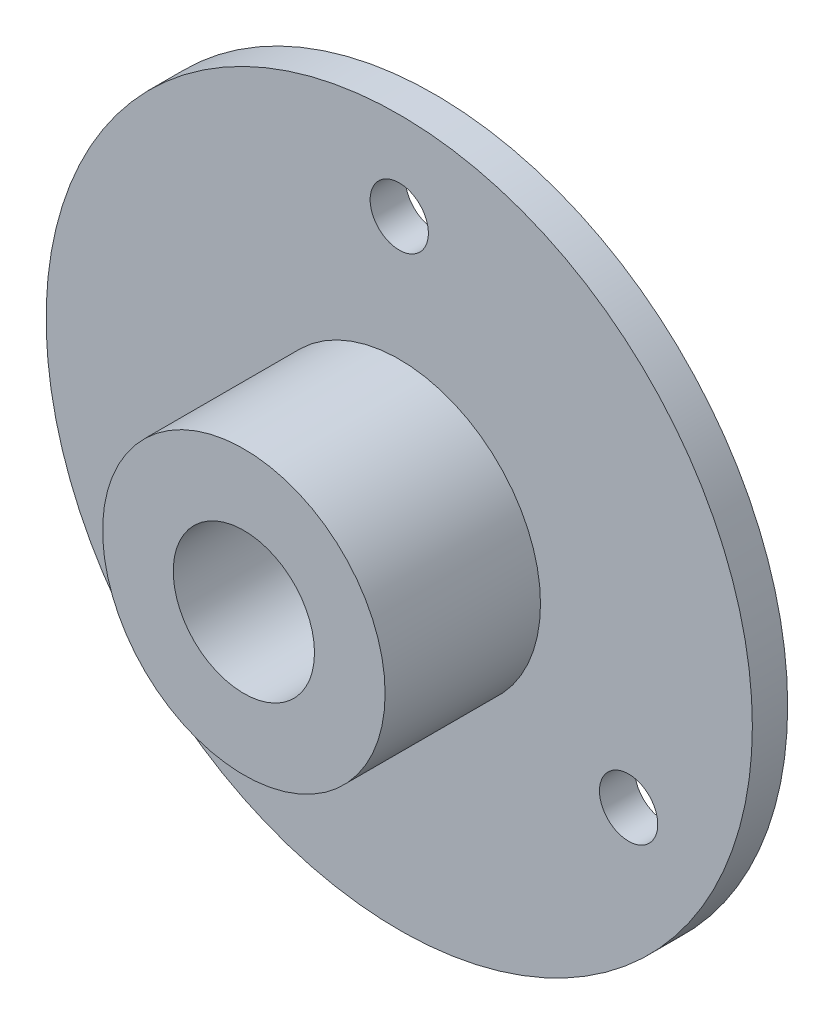
ISO-10303-21;
HEADER;
FILE_DESCRIPTION(('STEP AP214'),'2;1');
FILE_NAME('part.step','',(''),(''),'','','');
FILE_SCHEMA(('AUTOMOTIVE_DESIGN { 1 0 10303 214 1 1 1 1 }'));
ENDSEC;
DATA;
#1=APPLICATION_CONTEXT('core data for automotive mechanical design processes');
#2=APPLICATION_PROTOCOL_DEFINITION('international standard','automotive_design',2000,#1);
#3=PRODUCT_CONTEXT('',#1,'mechanical');
#4=PRODUCT('Part','Part','',(#3));
#5=PRODUCT_RELATED_PRODUCT_CATEGORY('part','',(#4));
#6=PRODUCT_DEFINITION_FORMATION('','',#4);
#7=PRODUCT_DEFINITION_CONTEXT('part definition',#1,'design');
#8=PRODUCT_DEFINITION('design','',#6,#7);
#9=PRODUCT_DEFINITION_SHAPE('','',#8);
#10=(LENGTH_UNIT() NAMED_UNIT(*) SI_UNIT(.MILLI.,.METRE.));
#11=(NAMED_UNIT(*) PLANE_ANGLE_UNIT() SI_UNIT($,.RADIAN.));
#12=(NAMED_UNIT(*) SI_UNIT($,.STERADIAN.) SOLID_ANGLE_UNIT());
#13=UNCERTAINTY_MEASURE_WITH_UNIT(LENGTH_MEASURE(1.E-05),#10,'distance_accuracy_value','');
#14=(GEOMETRIC_REPRESENTATION_CONTEXT(3) GLOBAL_UNCERTAINTY_ASSIGNED_CONTEXT((#13)) GLOBAL_UNIT_ASSIGNED_CONTEXT((#10,
#11,#12)) REPRESENTATION_CONTEXT('',''));
#15=CARTESIAN_POINT('',(0.,0.,0.));
#16=DIRECTION('',(0.,0.,1.));
#17=DIRECTION('',(1.,0.,0.));
#18=AXIS2_PLACEMENT_3D('',#15,#16,#17);
#19=CARTESIAN_POINT('',(0.,0.,2.));
#20=DIRECTION('',(0.,0.,-1.));
#21=DIRECTION('',(-1.,0.,0.));
#22=AXIS2_PLACEMENT_3D('',#19,#20,#21);
#23=CYLINDRICAL_SURFACE('',#22,20.);
#24=CARTESIAN_POINT('',(0.,0.,2.));
#25=DIRECTION('',(0.,0.,1.));
#26=DIRECTION('',(1.,0.,0.));
#27=AXIS2_PLACEMENT_3D('',#24,#25,#26);
#28=CIRCLE('',#27,20.);
#29=CARTESIAN_POINT('',(20.,0.,2.));
#30=VERTEX_POINT('',#29);
#31=EDGE_CURVE('E10',#30,#30,#28,.T.);
#32=ORIENTED_EDGE('',*,*,#31,.F.);
#33=EDGE_LOOP('',(#32));
#34=FACE_BOUND('',#33,.T.);
#35=CARTESIAN_POINT('',(0.,0.,0.));
#36=DIRECTION('',(0.,0.,1.));
#37=DIRECTION('',(1.,0.,0.));
#38=AXIS2_PLACEMENT_3D('',#35,#36,#37);
#39=CIRCLE('',#38,20.);
#40=CARTESIAN_POINT('',(20.,0.,0.));
#41=VERTEX_POINT('',#40);
#42=EDGE_CURVE('E34',#41,#41,#39,.T.);
#43=ORIENTED_EDGE('',*,*,#42,.T.);
#44=EDGE_LOOP('',(#43));
#45=FACE_BOUND('',#44,.T.);
#46=ADVANCED_FACE('F31',(#34,#45),#23,.T.);
#47=CARTESIAN_POINT('',(0.,0.,2.));
#48=DIRECTION('',(0.,0.,1.));
#49=DIRECTION('',(1.,0.,0.));
#50=AXIS2_PLACEMENT_3D('',#47,#48,#49);
#51=PLANE('',#50);
#52=CARTESIAN_POINT('',(12.9903810567666,-7.49999999999988,2.));
#53=DIRECTION('',(0.,0.,1.));
#54=DIRECTION('',(-0.499999999999992,-0.866025403784443,0.));
#55=AXIS2_PLACEMENT_3D('',#52,#53,#54);
#56=CIRCLE('',#55,1.65);
#57=CARTESIAN_POINT('',(13.8153810567666,-6.07105808375555,2.));
#58=VERTEX_POINT('',#57);
#59=EDGE_CURVE('E69',#58,#58,#56,.T.);
#60=ORIENTED_EDGE('',*,*,#59,.F.);
#61=EDGE_LOOP('',(#60));
#62=FACE_BOUND('',#61,.T.);
#63=CARTESIAN_POINT('',(-12.9903810567665,-7.50000000000006,2.));
#64=DIRECTION('',(0.,0.,1.));
#65=DIRECTION('',(-0.500000000000004,0.866025403784436,0.));
#66=AXIS2_PLACEMENT_3D('',#63,#64,#65);
#67=CIRCLE('',#66,1.65);
#68=CARTESIAN_POINT('',(-12.1653810567665,-8.92894191624438,2.));
#69=VERTEX_POINT('',#68);
#70=EDGE_CURVE('E63',#69,#69,#67,.T.);
#71=ORIENTED_EDGE('',*,*,#70,.F.);
#72=EDGE_LOOP('',(#71));
#73=FACE_BOUND('',#72,.T.);
#74=CARTESIAN_POINT('',(0.,15.,2.));
#75=DIRECTION('',(0.,0.,1.));
#76=DIRECTION('',(1.,0.,0.));
#77=AXIS2_PLACEMENT_3D('',#74,#75,#76);
#78=CIRCLE('',#77,1.65);
#79=CARTESIAN_POINT('',(-1.65,15.,2.));
#80=VERTEX_POINT('',#79);
#81=EDGE_CURVE('E52',#80,#80,#78,.T.);
#82=ORIENTED_EDGE('',*,*,#81,.F.);
#83=EDGE_LOOP('',(#82));
#84=FACE_BOUND('',#83,.T.);
#85=CARTESIAN_POINT('',(0.,0.,2.));
#86=DIRECTION('',(0.,0.,1.));
#87=DIRECTION('',(1.,0.,0.));
#88=AXIS2_PLACEMENT_3D('',#85,#86,#87);
#89=CIRCLE('',#88,8.);
#90=CARTESIAN_POINT('',(8.,0.,2.));
#91=VERTEX_POINT('',#90);
#92=EDGE_CURVE('E43',#91,#91,#89,.T.);
#93=ORIENTED_EDGE('',*,*,#92,.F.);
#94=EDGE_LOOP('',(#93));
#95=FACE_BOUND('',#94,.T.);
#96=ORIENTED_EDGE('',*,*,#31,.T.);
#97=EDGE_LOOP('',(#96));
#98=FACE_BOUND('',#97,.T.);
#99=ADVANCED_FACE('F76',(#62,#73,#84,#95,#98),#51,.T.);
#100=CARTESIAN_POINT('',(0.,0.,0.));
#101=DIRECTION('',(0.,0.,1.));
#102=DIRECTION('',(1.,0.,0.));
#103=AXIS2_PLACEMENT_3D('',#100,#101,#102);
#104=PLANE('',#103);
#105=CARTESIAN_POINT('',(12.9903810567666,-7.49999999999988,0.));
#106=DIRECTION('',(0.,0.,-1.));
#107=DIRECTION('',(0.499999999999992,0.866025403784443,0.));
#108=AXIS2_PLACEMENT_3D('',#105,#106,#107);
#109=CIRCLE('',#108,1.65);
#110=CARTESIAN_POINT('',(13.8153810567666,-6.07105808375555,0.));
#111=VERTEX_POINT('',#110);
#112=EDGE_CURVE('E66',#111,#111,#109,.T.);
#113=ORIENTED_EDGE('',*,*,#112,.F.);
#114=EDGE_LOOP('',(#113));
#115=FACE_BOUND('',#114,.T.);
#116=CARTESIAN_POINT('',(-12.9903810567665,-7.50000000000006,0.));
#117=DIRECTION('',(0.,0.,-1.));
#118=DIRECTION('',(0.500000000000004,-0.866025403784436,0.));
#119=AXIS2_PLACEMENT_3D('',#116,#117,#118);
#120=CIRCLE('',#119,1.65);
#121=CARTESIAN_POINT('',(-12.1653810567665,-8.92894191624438,0.));
#122=VERTEX_POINT('',#121);
#123=EDGE_CURVE('E60',#122,#122,#120,.T.);
#124=ORIENTED_EDGE('',*,*,#123,.F.);
#125=EDGE_LOOP('',(#124));
#126=FACE_BOUND('',#125,.T.);
#127=CARTESIAN_POINT('',(0.,15.,0.));
#128=DIRECTION('',(0.,0.,-1.));
#129=DIRECTION('',(-1.,0.,0.));
#130=AXIS2_PLACEMENT_3D('',#127,#128,#129);
#131=CIRCLE('',#130,1.65);
#132=CARTESIAN_POINT('',(-1.65,15.,0.));
#133=VERTEX_POINT('',#132);
#134=EDGE_CURVE('E57',#133,#133,#131,.T.);
#135=ORIENTED_EDGE('',*,*,#134,.F.);
#136=EDGE_LOOP('',(#135));
#137=FACE_BOUND('',#136,.T.);
#138=CARTESIAN_POINT('',(0.,0.,0.));
#139=DIRECTION('',(0.,0.,1.));
#140=DIRECTION('',(1.,0.,0.));
#141=AXIS2_PLACEMENT_3D('',#138,#139,#140);
#142=CIRCLE('',#141,4.);
#143=CARTESIAN_POINT('',(4.,0.,0.));
#144=VERTEX_POINT('',#143);
#145=EDGE_CURVE('E46',#144,#144,#142,.T.);
#146=ORIENTED_EDGE('',*,*,#145,.T.);
#147=EDGE_LOOP('',(#146));
#148=FACE_BOUND('',#147,.T.);
#149=ORIENTED_EDGE('',*,*,#42,.F.);
#150=EDGE_LOOP('',(#149));
#151=FACE_BOUND('',#150,.T.);
#152=ADVANCED_FACE('F79',(#115,#126,#137,#148,#151),#104,.F.);
#153=CARTESIAN_POINT('',(0.,0.,10.8));
#154=DIRECTION('',(0.,0.,-1.));
#155=DIRECTION('',(-1.,0.,0.));
#156=AXIS2_PLACEMENT_3D('',#153,#154,#155);
#157=CYLINDRICAL_SURFACE('',#156,8.);
#158=CARTESIAN_POINT('',(0.,0.,10.8));
#159=DIRECTION('',(0.,0.,1.));
#160=DIRECTION('',(1.,0.,0.));
#161=AXIS2_PLACEMENT_3D('',#158,#159,#160);
#162=CIRCLE('',#161,8.);
#163=CARTESIAN_POINT('',(8.,0.,10.8));
#164=VERTEX_POINT('',#163);
#165=EDGE_CURVE('E41',#164,#164,#162,.T.);
#166=ORIENTED_EDGE('',*,*,#165,.F.);
#167=EDGE_LOOP('',(#166));
#168=FACE_BOUND('',#167,.T.);
#169=ORIENTED_EDGE('',*,*,#92,.T.);
#170=EDGE_LOOP('',(#169));
#171=FACE_BOUND('',#170,.T.);
#172=ADVANCED_FACE('F87',(#168,#171),#157,.T.);
#173=CARTESIAN_POINT('',(0.,0.,10.8));
#174=DIRECTION('',(0.,0.,1.));
#175=DIRECTION('',(1.,0.,0.));
#176=AXIS2_PLACEMENT_3D('',#173,#174,#175);
#177=PLANE('',#176);
#178=CARTESIAN_POINT('',(0.,0.,10.8));
#179=DIRECTION('',(0.,0.,1.));
#180=DIRECTION('',(1.,0.,0.));
#181=AXIS2_PLACEMENT_3D('',#178,#179,#180);
#182=CIRCLE('',#181,4.);
#183=CARTESIAN_POINT('',(4.,0.,10.8));
#184=VERTEX_POINT('',#183);
#185=EDGE_CURVE('E49',#184,#184,#182,.T.);
#186=ORIENTED_EDGE('',*,*,#185,.F.);
#187=EDGE_LOOP('',(#186));
#188=FACE_BOUND('',#187,.T.);
#189=ORIENTED_EDGE('',*,*,#165,.T.);
#190=EDGE_LOOP('',(#189));
#191=FACE_BOUND('',#190,.T.);
#192=ADVANCED_FACE('F89',(#188,#191),#177,.T.);
#193=CARTESIAN_POINT('',(0.,0.,0.));
#194=DIRECTION('',(0.,0.,1.));
#195=DIRECTION('',(1.,0.,0.));
#196=AXIS2_PLACEMENT_3D('',#193,#194,#195);
#197=CYLINDRICAL_SURFACE('',#196,4.);
#198=CARTESIAN_POINT('',(4.,0.,0.));
#199=CARTESIAN_POINT('',(4.,0.,0.1125));
#200=CARTESIAN_POINT('',(4.,0.,0.225));
#201=CARTESIAN_POINT('',(4.,0.,0.45));
#202=CARTESIAN_POINT('',(4.,0.,0.5625));
#203=CARTESIAN_POINT('',(4.,0.,0.7875));
#204=CARTESIAN_POINT('',(4.,0.,0.9));
#205=CARTESIAN_POINT('',(4.,0.,1.125));
#206=CARTESIAN_POINT('',(4.,0.,1.2375));
#207=CARTESIAN_POINT('',(4.,0.,1.4625));
#208=CARTESIAN_POINT('',(4.,0.,1.575));
#209=CARTESIAN_POINT('',(4.,0.,1.8));
#210=CARTESIAN_POINT('',(4.,0.,1.9125));
#211=CARTESIAN_POINT('',(4.,0.,2.1375));
#212=CARTESIAN_POINT('',(4.,0.,2.25));
#213=CARTESIAN_POINT('',(4.,0.,2.475));
#214=CARTESIAN_POINT('',(4.,0.,2.5875));
#215=CARTESIAN_POINT('',(4.,0.,2.8125));
#216=CARTESIAN_POINT('',(4.,0.,2.925));
#217=CARTESIAN_POINT('',(4.,0.,3.15));
#218=CARTESIAN_POINT('',(4.,0.,3.2625));
#219=CARTESIAN_POINT('',(4.,0.,3.4875));
#220=CARTESIAN_POINT('',(4.,0.,3.6));
#221=CARTESIAN_POINT('',(4.,0.,3.825));
#222=CARTESIAN_POINT('',(4.,0.,3.9375));
#223=CARTESIAN_POINT('',(4.,0.,4.1625));
#224=CARTESIAN_POINT('',(4.,0.,4.275));
#225=CARTESIAN_POINT('',(4.,0.,4.5));
#226=CARTESIAN_POINT('',(4.,0.,4.6125));
#227=CARTESIAN_POINT('',(4.,0.,4.8375));
#228=CARTESIAN_POINT('',(4.,0.,4.95));
#229=CARTESIAN_POINT('',(4.,0.,5.175));
#230=CARTESIAN_POINT('',(4.,0.,5.2875));
#231=CARTESIAN_POINT('',(4.,0.,5.5125));
#232=CARTESIAN_POINT('',(4.,0.,5.625));
#233=CARTESIAN_POINT('',(4.,0.,5.85));
#234=CARTESIAN_POINT('',(4.,0.,5.9625));
#235=CARTESIAN_POINT('',(4.,0.,6.1875));
#236=CARTESIAN_POINT('',(4.,0.,6.3));
#237=CARTESIAN_POINT('',(4.,0.,6.525));
#238=CARTESIAN_POINT('',(4.,0.,6.6375));
#239=CARTESIAN_POINT('',(4.,0.,6.8625));
#240=CARTESIAN_POINT('',(4.,0.,6.975));
#241=CARTESIAN_POINT('',(4.,0.,7.2));
#242=CARTESIAN_POINT('',(4.,0.,7.3125));
#243=CARTESIAN_POINT('',(4.,0.,7.5375));
#244=CARTESIAN_POINT('',(4.,0.,7.65));
#245=CARTESIAN_POINT('',(4.,0.,7.875));
#246=CARTESIAN_POINT('',(4.,0.,7.9875));
#247=CARTESIAN_POINT('',(4.,0.,8.2125));
#248=CARTESIAN_POINT('',(4.,0.,8.325));
#249=CARTESIAN_POINT('',(4.,0.,8.55));
#250=CARTESIAN_POINT('',(4.,0.,8.6625));
#251=CARTESIAN_POINT('',(4.,0.,8.8875));
#252=CARTESIAN_POINT('',(4.,0.,9.));
#253=CARTESIAN_POINT('',(4.,0.,9.225));
#254=CARTESIAN_POINT('',(4.,0.,9.3375));
#255=CARTESIAN_POINT('',(4.,0.,9.5625));
#256=CARTESIAN_POINT('',(4.,0.,9.675));
#257=CARTESIAN_POINT('',(4.,0.,9.9));
#258=CARTESIAN_POINT('',(4.,0.,10.0125));
#259=CARTESIAN_POINT('',(4.,0.,10.2375));
#260=CARTESIAN_POINT('',(4.,0.,10.35));
#261=CARTESIAN_POINT('',(4.,0.,10.575));
#262=CARTESIAN_POINT('',(4.,0.,10.6875));
#263=CARTESIAN_POINT('',(4.,0.,10.8));
#264=B_SPLINE_CURVE_WITH_KNOTS('',3,(#198,#199,#200,#201,#202,#203,#204,#205,#206,#207,#208,
#209,#210,#211,#212,#213,#214,#215,#216,#217,#218,#219,#220,#221,#222,#223,#224,#225,#226,#227,
#228,#229,#230,#231,#232,#233,#234,#235,#236,#237,#238,#239,#240,#241,#242,#243,#244,#245,#246,
#247,#248,#249,#250,#251,#252,#253,#254,#255,#256,#257,#258,#259,#260,#261,#262,#263),
.UNSPECIFIED.,.F.,.F.,(4,2,2,2,2,2,2,2,2,2,2,2,2,2,2,2,2,2,2,2,2,2,2,2,2,2,2,2,2,2,2,2,4),(0.,
0.3375,0.675,1.0125,1.35,1.6875,2.025,2.3625,2.7,3.0375,3.375,3.7125,4.05,4.3875,4.725,5.0625,
5.4,5.7375,6.075,6.4125,6.75,7.0875,7.425,7.7625,8.1,8.4375,8.775,9.1125,9.45,9.7875,10.125,
10.4625,10.8),.UNSPECIFIED.);
#265=EDGE_CURVE('BSEAM96',#144,#184,#264,.T.);
#266=ORIENTED_EDGE('',*,*,#145,.F.);
#267=ORIENTED_EDGE('',*,*,#185,.T.);
#268=ORIENTED_EDGE('',*,*,#265,.T.);
#269=ORIENTED_EDGE('',*,*,#265,.F.);
#270=EDGE_LOOP('',(#266,#268,#267,#269));
#271=FACE_BOUND('',#270,.T.);
#272=ADVANCED_FACE('F96',(#271),#197,.F.);
#273=CARTESIAN_POINT('',(0.,15.,10.8));
#274=DIRECTION('',(0.,0.,-1.));
#275=DIRECTION('',(-1.,0.,0.));
#276=AXIS2_PLACEMENT_3D('',#273,#274,#275);
#277=CYLINDRICAL_SURFACE('',#276,1.65);
#278=CARTESIAN_POINT('',(-1.65,15.,2.));
#279=CARTESIAN_POINT('',(-1.65,15.,1.97916666666667));
#280=CARTESIAN_POINT('',(-1.65,15.,1.95833333333333));
#281=CARTESIAN_POINT('',(-1.65,15.,1.91666666666667));
#282=CARTESIAN_POINT('',(-1.65,15.,1.89583333333333));
#283=CARTESIAN_POINT('',(-1.65,15.,1.85416666666667));
#284=CARTESIAN_POINT('',(-1.65,15.,1.83333333333333));
#285=CARTESIAN_POINT('',(-1.65,15.,1.79166666666667));
#286=CARTESIAN_POINT('',(-1.65,15.,1.77083333333333));
#287=CARTESIAN_POINT('',(-1.65,15.,1.72916666666667));
#288=CARTESIAN_POINT('',(-1.65,15.,1.70833333333333));
#289=CARTESIAN_POINT('',(-1.65,15.,1.66666666666667));
#290=CARTESIAN_POINT('',(-1.65,15.,1.64583333333333));
#291=CARTESIAN_POINT('',(-1.65,15.,1.60416666666667));
#292=CARTESIAN_POINT('',(-1.65,15.,1.58333333333333));
#293=CARTESIAN_POINT('',(-1.65,15.,1.54166666666667));
#294=CARTESIAN_POINT('',(-1.65,15.,1.52083333333333));
#295=CARTESIAN_POINT('',(-1.65,15.,1.47916666666667));
#296=CARTESIAN_POINT('',(-1.65,15.,1.45833333333333));
#297=CARTESIAN_POINT('',(-1.65,15.,1.41666666666667));
#298=CARTESIAN_POINT('',(-1.65,15.,1.39583333333333));
#299=CARTESIAN_POINT('',(-1.65,15.,1.35416666666667));
#300=CARTESIAN_POINT('',(-1.65,15.,1.33333333333333));
#301=CARTESIAN_POINT('',(-1.65,15.,1.29166666666667));
#302=CARTESIAN_POINT('',(-1.65,15.,1.27083333333333));
#303=CARTESIAN_POINT('',(-1.65,15.,1.22916666666667));
#304=CARTESIAN_POINT('',(-1.65,15.,1.20833333333333));
#305=CARTESIAN_POINT('',(-1.65,15.,1.16666666666667));
#306=CARTESIAN_POINT('',(-1.65,15.,1.14583333333333));
#307=CARTESIAN_POINT('',(-1.65,15.,1.10416666666667));
#308=CARTESIAN_POINT('',(-1.65,15.,1.08333333333333));
#309=CARTESIAN_POINT('',(-1.65,15.,1.04166666666667));
#310=CARTESIAN_POINT('',(-1.65,15.,1.02083333333333));
#311=CARTESIAN_POINT('',(-1.65,15.,0.979166666666668));
#312=CARTESIAN_POINT('',(-1.65,15.,0.958333333333334));
#313=CARTESIAN_POINT('',(-1.65,15.,0.916666666666668));
#314=CARTESIAN_POINT('',(-1.65,15.,0.895833333333334));
#315=CARTESIAN_POINT('',(-1.65,15.,0.854166666666667));
#316=CARTESIAN_POINT('',(-1.65,15.,0.833333333333334));
#317=CARTESIAN_POINT('',(-1.65,15.,0.791666666666667));
#318=CARTESIAN_POINT('',(-1.65,15.,0.770833333333334));
#319=CARTESIAN_POINT('',(-1.65,15.,0.729166666666667));
#320=CARTESIAN_POINT('',(-1.65,15.,0.708333333333334));
#321=CARTESIAN_POINT('',(-1.65,15.,0.666666666666667));
#322=CARTESIAN_POINT('',(-1.65,15.,0.645833333333334));
#323=CARTESIAN_POINT('',(-1.65,15.,0.604166666666668));
#324=CARTESIAN_POINT('',(-1.65,15.,0.583333333333335));
#325=CARTESIAN_POINT('',(-1.65,15.,0.541666666666669));
#326=CARTESIAN_POINT('',(-1.65,15.,0.520833333333335));
#327=CARTESIAN_POINT('',(-1.65,15.,0.479166666666669));
#328=CARTESIAN_POINT('',(-1.65,15.,0.458333333333335));
#329=CARTESIAN_POINT('',(-1.65,15.,0.416666666666669));
#330=CARTESIAN_POINT('',(-1.65,15.,0.395833333333335));
#331=CARTESIAN_POINT('',(-1.65,15.,0.354166666666669));
#332=CARTESIAN_POINT('',(-1.65,15.,0.333333333333335));
#333=CARTESIAN_POINT('',(-1.65,15.,0.291666666666669));
#334=CARTESIAN_POINT('',(-1.65,15.,0.270833333333335));
#335=CARTESIAN_POINT('',(-1.65,15.,0.229166666666669));
#336=CARTESIAN_POINT('',(-1.65,15.,0.208333333333335));
#337=CARTESIAN_POINT('',(-1.65,15.,0.166666666666669));
#338=CARTESIAN_POINT('',(-1.65,15.,0.145833333333335));
#339=CARTESIAN_POINT('',(-1.65,15.,0.104166666666669));
#340=CARTESIAN_POINT('',(-1.65,15.,0.0833333333333351));
#341=CARTESIAN_POINT('',(-1.65,15.,0.0416666666666684));
#342=CARTESIAN_POINT('',(-1.65,15.,0.0208333333333351));
#343=CARTESIAN_POINT('',(-1.65,15.,0.));
#344=B_SPLINE_CURVE_WITH_KNOTS('',3,(#278,#279,#280,#281,#282,#283,#284,#285,#286,#287,#288,
#289,#290,#291,#292,#293,#294,#295,#296,#297,#298,#299,#300,#301,#302,#303,#304,#305,#306,#307,
#308,#309,#310,#311,#312,#313,#314,#315,#316,#317,#318,#319,#320,#321,#322,#323,#324,#325,#326,
#327,#328,#329,#330,#331,#332,#333,#334,#335,#336,#337,#338,#339,#340,#341,#342,#343),
.UNSPECIFIED.,.F.,.F.,(4,2,2,2,2,2,2,2,2,2,2,2,2,2,2,2,2,2,2,2,2,2,2,2,2,2,2,2,2,2,2,2,4),(0.,
0.0625000000000001,0.125,0.1875,0.25,0.3125,0.375,0.4375,0.5,0.562499999999999,
0.624999999999999,0.687499999999999,0.749999999999999,0.812499999999999,0.874999999999999,
0.937499999999999,0.999999999999999,1.0625,1.125,1.1875,1.25,1.3125,1.375,1.4375,1.5,1.5625,
1.625,1.6875,1.75,1.8125,1.875,1.9375,2.),.UNSPECIFIED.);
#345=EDGE_CURVE('BSEAM128',#80,#133,#344,.T.);
#346=ORIENTED_EDGE('',*,*,#81,.T.);
#347=ORIENTED_EDGE('',*,*,#134,.T.);
#348=ORIENTED_EDGE('',*,*,#345,.T.);
#349=ORIENTED_EDGE('',*,*,#345,.F.);
#350=EDGE_LOOP('',(#346,#348,#347,#349));
#351=FACE_BOUND('',#350,.T.);
#352=ADVANCED_FACE('F128',(#351),#277,.F.);
#353=CARTESIAN_POINT('',(-12.9903810567665,-7.50000000000006,10.8));
#354=DIRECTION('',(0.,0.,-1.));
#355=DIRECTION('',(0.500000000000004,-0.866025403784436,0.));
#356=AXIS2_PLACEMENT_3D('',#353,#354,#355);
#357=CYLINDRICAL_SURFACE('',#356,1.65);
#358=CARTESIAN_POINT('',(-12.1653810567665,-8.92894191624438,2.));
#359=CARTESIAN_POINT('',(-12.1653810567665,-8.92894191624438,1.97916666666667));
#360=CARTESIAN_POINT('',(-12.1653810567665,-8.92894191624438,1.95833333333333));
#361=CARTESIAN_POINT('',(-12.1653810567665,-8.92894191624438,1.91666666666667));
#362=CARTESIAN_POINT('',(-12.1653810567665,-8.92894191624438,1.89583333333333));
#363=CARTESIAN_POINT('',(-12.1653810567665,-8.92894191624438,1.85416666666667));
#364=CARTESIAN_POINT('',(-12.1653810567665,-8.92894191624438,1.83333333333333));
#365=CARTESIAN_POINT('',(-12.1653810567665,-8.92894191624438,1.79166666666667));
#366=CARTESIAN_POINT('',(-12.1653810567665,-8.92894191624438,1.77083333333333));
#367=CARTESIAN_POINT('',(-12.1653810567665,-8.92894191624438,1.72916666666667));
#368=CARTESIAN_POINT('',(-12.1653810567665,-8.92894191624438,1.70833333333333));
#369=CARTESIAN_POINT('',(-12.1653810567665,-8.92894191624438,1.66666666666667));
#370=CARTESIAN_POINT('',(-12.1653810567665,-8.92894191624438,1.64583333333333));
#371=CARTESIAN_POINT('',(-12.1653810567665,-8.92894191624438,1.60416666666667));
#372=CARTESIAN_POINT('',(-12.1653810567665,-8.92894191624438,1.58333333333333));
#373=CARTESIAN_POINT('',(-12.1653810567665,-8.92894191624438,1.54166666666667));
#374=CARTESIAN_POINT('',(-12.1653810567665,-8.92894191624438,1.52083333333333));
#375=CARTESIAN_POINT('',(-12.1653810567665,-8.92894191624438,1.47916666666667));
#376=CARTESIAN_POINT('',(-12.1653810567665,-8.92894191624438,1.45833333333333));
#377=CARTESIAN_POINT('',(-12.1653810567665,-8.92894191624438,1.41666666666667));
#378=CARTESIAN_POINT('',(-12.1653810567665,-8.92894191624438,1.39583333333333));
#379=CARTESIAN_POINT('',(-12.1653810567665,-8.92894191624438,1.35416666666667));
#380=CARTESIAN_POINT('',(-12.1653810567665,-8.92894191624438,1.33333333333333));
#381=CARTESIAN_POINT('',(-12.1653810567665,-8.92894191624438,1.29166666666667));
#382=CARTESIAN_POINT('',(-12.1653810567665,-8.92894191624438,1.27083333333333));
#383=CARTESIAN_POINT('',(-12.1653810567665,-8.92894191624438,1.22916666666667));
#384=CARTESIAN_POINT('',(-12.1653810567665,-8.92894191624438,1.20833333333333));
#385=CARTESIAN_POINT('',(-12.1653810567665,-8.92894191624438,1.16666666666667));
#386=CARTESIAN_POINT('',(-12.1653810567665,-8.92894191624438,1.14583333333333));
#387=CARTESIAN_POINT('',(-12.1653810567665,-8.92894191624438,1.10416666666667));
#388=CARTESIAN_POINT('',(-12.1653810567665,-8.92894191624438,1.08333333333333));
#389=CARTESIAN_POINT('',(-12.1653810567665,-8.92894191624438,1.04166666666667));
#390=CARTESIAN_POINT('',(-12.1653810567665,-8.92894191624438,1.02083333333333));
#391=CARTESIAN_POINT('',(-12.1653810567665,-8.92894191624438,0.979166666666668));
#392=CARTESIAN_POINT('',(-12.1653810567665,-8.92894191624438,0.958333333333334));
#393=CARTESIAN_POINT('',(-12.1653810567665,-8.92894191624438,0.916666666666668));
#394=CARTESIAN_POINT('',(-12.1653810567665,-8.92894191624438,0.895833333333334));
#395=CARTESIAN_POINT('',(-12.1653810567665,-8.92894191624438,0.854166666666667));
#396=CARTESIAN_POINT('',(-12.1653810567665,-8.92894191624438,0.833333333333334));
#397=CARTESIAN_POINT('',(-12.1653810567665,-8.92894191624438,0.791666666666667));
#398=CARTESIAN_POINT('',(-12.1653810567665,-8.92894191624438,0.770833333333334));
#399=CARTESIAN_POINT('',(-12.1653810567665,-8.92894191624438,0.729166666666667));
#400=CARTESIAN_POINT('',(-12.1653810567665,-8.92894191624438,0.708333333333334));
#401=CARTESIAN_POINT('',(-12.1653810567665,-8.92894191624438,0.666666666666667));
#402=CARTESIAN_POINT('',(-12.1653810567665,-8.92894191624438,0.645833333333334));
#403=CARTESIAN_POINT('',(-12.1653810567665,-8.92894191624438,0.604166666666668));
#404=CARTESIAN_POINT('',(-12.1653810567665,-8.92894191624438,0.583333333333335));
#405=CARTESIAN_POINT('',(-12.1653810567665,-8.92894191624438,0.541666666666669));
#406=CARTESIAN_POINT('',(-12.1653810567665,-8.92894191624438,0.520833333333335));
#407=CARTESIAN_POINT('',(-12.1653810567665,-8.92894191624438,0.479166666666669));
#408=CARTESIAN_POINT('',(-12.1653810567665,-8.92894191624438,0.458333333333335));
#409=CARTESIAN_POINT('',(-12.1653810567665,-8.92894191624438,0.416666666666669));
#410=CARTESIAN_POINT('',(-12.1653810567665,-8.92894191624438,0.395833333333335));
#411=CARTESIAN_POINT('',(-12.1653810567665,-8.92894191624438,0.354166666666669));
#412=CARTESIAN_POINT('',(-12.1653810567665,-8.92894191624438,0.333333333333335));
#413=CARTESIAN_POINT('',(-12.1653810567665,-8.92894191624438,0.291666666666669));
#414=CARTESIAN_POINT('',(-12.1653810567665,-8.92894191624438,0.270833333333335));
#415=CARTESIAN_POINT('',(-12.1653810567665,-8.92894191624438,0.229166666666669));
#416=CARTESIAN_POINT('',(-12.1653810567665,-8.92894191624438,0.208333333333335));
#417=CARTESIAN_POINT('',(-12.1653810567665,-8.92894191624438,0.166666666666669));
#418=CARTESIAN_POINT('',(-12.1653810567665,-8.92894191624438,0.145833333333335));
#419=CARTESIAN_POINT('',(-12.1653810567665,-8.92894191624438,0.104166666666669));
#420=CARTESIAN_POINT('',(-12.1653810567665,-8.92894191624438,0.0833333333333351));
#421=CARTESIAN_POINT('',(-12.1653810567665,-8.92894191624438,0.0416666666666684));
#422=CARTESIAN_POINT('',(-12.1653810567665,-8.92894191624438,0.0208333333333351));
#423=CARTESIAN_POINT('',(-12.1653810567665,-8.92894191624438,0.));
#424=B_SPLINE_CURVE_WITH_KNOTS('',3,(#358,#359,#360,#361,#362,#363,#364,#365,#366,#367,#368,
#369,#370,#371,#372,#373,#374,#375,#376,#377,#378,#379,#380,#381,#382,#383,#384,#385,#386,#387,
#388,#389,#390,#391,#392,#393,#394,#395,#396,#397,#398,#399,#400,#401,#402,#403,#404,#405,#406,
#407,#408,#409,#410,#411,#412,#413,#414,#415,#416,#417,#418,#419,#420,#421,#422,#423),
.UNSPECIFIED.,.F.,.F.,(4,2,2,2,2,2,2,2,2,2,2,2,2,2,2,2,2,2,2,2,2,2,2,2,2,2,2,2,2,2,2,2,4),(0.,
0.0625000000000001,0.125,0.1875,0.25,0.3125,0.375,0.4375,0.5,0.562499999999999,
0.624999999999999,0.687499999999999,0.749999999999999,0.812499999999999,0.874999999999999,
0.937499999999999,0.999999999999999,1.0625,1.125,1.1875,1.25,1.3125,1.375,1.4375,1.5,1.5625,
1.625,1.6875,1.75,1.8125,1.875,1.9375,2.),.UNSPECIFIED.);
#425=EDGE_CURVE('BSEAM123',#69,#122,#424,.T.);
#426=ORIENTED_EDGE('',*,*,#70,.T.);
#427=ORIENTED_EDGE('',*,*,#123,.T.);
#428=ORIENTED_EDGE('',*,*,#425,.T.);
#429=ORIENTED_EDGE('',*,*,#425,.F.);
#430=EDGE_LOOP('',(#426,#428,#427,#429));
#431=FACE_BOUND('',#430,.T.);
#432=ADVANCED_FACE('F123',(#431),#357,.F.);
#433=CARTESIAN_POINT('',(12.9903810567666,-7.49999999999988,10.8));
#434=DIRECTION('',(0.,0.,-1.));
#435=DIRECTION('',(0.499999999999992,0.866025403784443,0.));
#436=AXIS2_PLACEMENT_3D('',#433,#434,#435);
#437=CYLINDRICAL_SURFACE('',#436,1.65);
#438=CARTESIAN_POINT('',(13.8153810567666,-6.07105808375555,2.));
#439=CARTESIAN_POINT('',(13.8153810567666,-6.07105808375555,1.97916666666667));
#440=CARTESIAN_POINT('',(13.8153810567666,-6.07105808375555,1.95833333333333));
#441=CARTESIAN_POINT('',(13.8153810567666,-6.07105808375555,1.91666666666667));
#442=CARTESIAN_POINT('',(13.8153810567666,-6.07105808375555,1.89583333333333));
#443=CARTESIAN_POINT('',(13.8153810567666,-6.07105808375555,1.85416666666667));
#444=CARTESIAN_POINT('',(13.8153810567666,-6.07105808375555,1.83333333333333));
#445=CARTESIAN_POINT('',(13.8153810567666,-6.07105808375555,1.79166666666667));
#446=CARTESIAN_POINT('',(13.8153810567666,-6.07105808375555,1.77083333333333));
#447=CARTESIAN_POINT('',(13.8153810567666,-6.07105808375555,1.72916666666667));
#448=CARTESIAN_POINT('',(13.8153810567666,-6.07105808375555,1.70833333333333));
#449=CARTESIAN_POINT('',(13.8153810567666,-6.07105808375555,1.66666666666667));
#450=CARTESIAN_POINT('',(13.8153810567666,-6.07105808375555,1.64583333333333));
#451=CARTESIAN_POINT('',(13.8153810567666,-6.07105808375555,1.60416666666667));
#452=CARTESIAN_POINT('',(13.8153810567666,-6.07105808375555,1.58333333333333));
#453=CARTESIAN_POINT('',(13.8153810567666,-6.07105808375555,1.54166666666667));
#454=CARTESIAN_POINT('',(13.8153810567666,-6.07105808375555,1.52083333333333));
#455=CARTESIAN_POINT('',(13.8153810567666,-6.07105808375555,1.47916666666667));
#456=CARTESIAN_POINT('',(13.8153810567666,-6.07105808375555,1.45833333333333));
#457=CARTESIAN_POINT('',(13.8153810567666,-6.07105808375555,1.41666666666667));
#458=CARTESIAN_POINT('',(13.8153810567666,-6.07105808375555,1.39583333333333));
#459=CARTESIAN_POINT('',(13.8153810567666,-6.07105808375555,1.35416666666667));
#460=CARTESIAN_POINT('',(13.8153810567666,-6.07105808375555,1.33333333333333));
#461=CARTESIAN_POINT('',(13.8153810567666,-6.07105808375555,1.29166666666667));
#462=CARTESIAN_POINT('',(13.8153810567666,-6.07105808375555,1.27083333333333));
#463=CARTESIAN_POINT('',(13.8153810567666,-6.07105808375555,1.22916666666667));
#464=CARTESIAN_POINT('',(13.8153810567666,-6.07105808375555,1.20833333333333));
#465=CARTESIAN_POINT('',(13.8153810567666,-6.07105808375555,1.16666666666667));
#466=CARTESIAN_POINT('',(13.8153810567666,-6.07105808375555,1.14583333333333));
#467=CARTESIAN_POINT('',(13.8153810567666,-6.07105808375555,1.10416666666667));
#468=CARTESIAN_POINT('',(13.8153810567666,-6.07105808375555,1.08333333333333));
#469=CARTESIAN_POINT('',(13.8153810567666,-6.07105808375555,1.04166666666667));
#470=CARTESIAN_POINT('',(13.8153810567666,-6.07105808375555,1.02083333333333));
#471=CARTESIAN_POINT('',(13.8153810567666,-6.07105808375555,0.979166666666668));
#472=CARTESIAN_POINT('',(13.8153810567666,-6.07105808375555,0.958333333333334));
#473=CARTESIAN_POINT('',(13.8153810567666,-6.07105808375555,0.916666666666668));
#474=CARTESIAN_POINT('',(13.8153810567666,-6.07105808375555,0.895833333333334));
#475=CARTESIAN_POINT('',(13.8153810567666,-6.07105808375555,0.854166666666667));
#476=CARTESIAN_POINT('',(13.8153810567666,-6.07105808375555,0.833333333333334));
#477=CARTESIAN_POINT('',(13.8153810567666,-6.07105808375555,0.791666666666667));
#478=CARTESIAN_POINT('',(13.8153810567666,-6.07105808375555,0.770833333333334));
#479=CARTESIAN_POINT('',(13.8153810567666,-6.07105808375555,0.729166666666667));
#480=CARTESIAN_POINT('',(13.8153810567666,-6.07105808375555,0.708333333333334));
#481=CARTESIAN_POINT('',(13.8153810567666,-6.07105808375555,0.666666666666667));
#482=CARTESIAN_POINT('',(13.8153810567666,-6.07105808375555,0.645833333333334));
#483=CARTESIAN_POINT('',(13.8153810567666,-6.07105808375555,0.604166666666668));
#484=CARTESIAN_POINT('',(13.8153810567666,-6.07105808375555,0.583333333333335));
#485=CARTESIAN_POINT('',(13.8153810567666,-6.07105808375555,0.541666666666669));
#486=CARTESIAN_POINT('',(13.8153810567666,-6.07105808375555,0.520833333333335));
#487=CARTESIAN_POINT('',(13.8153810567666,-6.07105808375555,0.479166666666669));
#488=CARTESIAN_POINT('',(13.8153810567666,-6.07105808375555,0.458333333333335));
#489=CARTESIAN_POINT('',(13.8153810567666,-6.07105808375555,0.416666666666669));
#490=CARTESIAN_POINT('',(13.8153810567666,-6.07105808375555,0.395833333333335));
#491=CARTESIAN_POINT('',(13.8153810567666,-6.07105808375555,0.354166666666669));
#492=CARTESIAN_POINT('',(13.8153810567666,-6.07105808375555,0.333333333333335));
#493=CARTESIAN_POINT('',(13.8153810567666,-6.07105808375555,0.291666666666669));
#494=CARTESIAN_POINT('',(13.8153810567666,-6.07105808375555,0.270833333333335));
#495=CARTESIAN_POINT('',(13.8153810567666,-6.07105808375555,0.229166666666669));
#496=CARTESIAN_POINT('',(13.8153810567666,-6.07105808375555,0.208333333333335));
#497=CARTESIAN_POINT('',(13.8153810567666,-6.07105808375555,0.166666666666669));
#498=CARTESIAN_POINT('',(13.8153810567666,-6.07105808375555,0.145833333333335));
#499=CARTESIAN_POINT('',(13.8153810567666,-6.07105808375555,0.104166666666669));
#500=CARTESIAN_POINT('',(13.8153810567666,-6.07105808375555,0.0833333333333351));
#501=CARTESIAN_POINT('',(13.8153810567666,-6.07105808375555,0.0416666666666684));
#502=CARTESIAN_POINT('',(13.8153810567666,-6.07105808375555,0.0208333333333351));
#503=CARTESIAN_POINT('',(13.8153810567666,-6.07105808375555,0.));
#504=B_SPLINE_CURVE_WITH_KNOTS('',3,(#438,#439,#440,#441,#442,#443,#444,#445,#446,#447,#448,
#449,#450,#451,#452,#453,#454,#455,#456,#457,#458,#459,#460,#461,#462,#463,#464,#465,#466,#467,
#468,#469,#470,#471,#472,#473,#474,#475,#476,#477,#478,#479,#480,#481,#482,#483,#484,#485,#486,
#487,#488,#489,#490,#491,#492,#493,#494,#495,#496,#497,#498,#499,#500,#501,#502,#503),
.UNSPECIFIED.,.F.,.F.,(4,2,2,2,2,2,2,2,2,2,2,2,2,2,2,2,2,2,2,2,2,2,2,2,2,2,2,2,2,2,2,2,4),(0.,
0.0625000000000001,0.125,0.1875,0.25,0.3125,0.375,0.4375,0.5,0.562499999999999,
0.624999999999999,0.687499999999999,0.749999999999999,0.812499999999999,0.874999999999999,
0.937499999999999,0.999999999999999,1.0625,1.125,1.1875,1.25,1.3125,1.375,1.4375,1.5,1.5625,
1.625,1.6875,1.75,1.8125,1.875,1.9375,2.),.UNSPECIFIED.);
#505=EDGE_CURVE('BSEAM73',#58,#111,#504,.T.);
#506=ORIENTED_EDGE('',*,*,#59,.T.);
#507=ORIENTED_EDGE('',*,*,#112,.T.);
#508=ORIENTED_EDGE('',*,*,#505,.T.);
#509=ORIENTED_EDGE('',*,*,#505,.F.);
#510=EDGE_LOOP('',(#506,#508,#507,#509));
#511=FACE_BOUND('',#510,.T.);
#512=ADVANCED_FACE('F73',(#511),#437,.F.);
#513=CLOSED_SHELL('',(#46,#99,#152,#172,#192,#272,#352,#432,#512));
#514=MANIFOLD_SOLID_BREP('B2',#513);
#515=ADVANCED_BREP_SHAPE_REPRESENTATION('',(#18,#514),#14);
#516=SHAPE_DEFINITION_REPRESENTATION(#9,#515);
ENDSEC;
END-ISO-10303-21;
